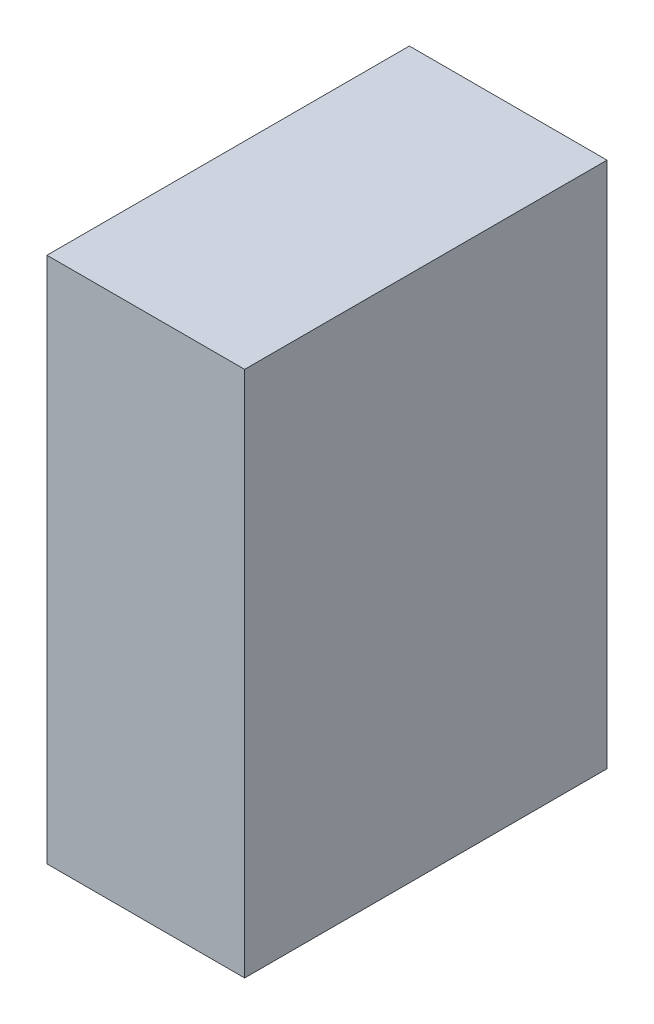
ISO-10303-21;
HEADER;
FILE_DESCRIPTION(('STEP AP214'),'2;1');
FILE_NAME('part.step','',(''),(''),'','','');
FILE_SCHEMA(('AUTOMOTIVE_DESIGN { 1 0 10303 214 1 1 1 1 }'));
ENDSEC;
DATA;
#1=APPLICATION_CONTEXT('core data for automotive mechanical design processes');
#2=APPLICATION_PROTOCOL_DEFINITION('international standard','automotive_design',2000,#1);
#3=PRODUCT_CONTEXT('',#1,'mechanical');
#4=PRODUCT('Part','Part','',(#3));
#5=PRODUCT_RELATED_PRODUCT_CATEGORY('part','',(#4));
#6=PRODUCT_DEFINITION_FORMATION('','',#4);
#7=PRODUCT_DEFINITION_CONTEXT('part definition',#1,'design');
#8=PRODUCT_DEFINITION('design','',#6,#7);
#9=PRODUCT_DEFINITION_SHAPE('','',#8);
#10=(LENGTH_UNIT() NAMED_UNIT(*) SI_UNIT(.MILLI.,.METRE.));
#11=(NAMED_UNIT(*) PLANE_ANGLE_UNIT() SI_UNIT($,.RADIAN.));
#12=(NAMED_UNIT(*) SI_UNIT($,.STERADIAN.) SOLID_ANGLE_UNIT());
#13=UNCERTAINTY_MEASURE_WITH_UNIT(LENGTH_MEASURE(1.E-05),#10,'distance_accuracy_value','');
#14=(GEOMETRIC_REPRESENTATION_CONTEXT(3) GLOBAL_UNCERTAINTY_ASSIGNED_CONTEXT((#13)) GLOBAL_UNIT_ASSIGNED_CONTEXT((#10,
#11,#12)) REPRESENTATION_CONTEXT('',''));
#15=CARTESIAN_POINT('',(0.,0.,0.));
#16=DIRECTION('',(0.,0.,1.));
#17=DIRECTION('',(1.,0.,0.));
#18=AXIS2_PLACEMENT_3D('',#15,#16,#17);
#19=CARTESIAN_POINT('',(0.3,0.,0.));
#20=DIRECTION('',(1.,0.,0.));
#21=DIRECTION('',(0.,0.,-1.));
#22=AXIS2_PLACEMENT_3D('',#19,#20,#21);
#23=PLANE('',#22);
#24=DIRECTION('',(0.,0.,1.));
#25=VECTOR('',#24,1.);
#26=CARTESIAN_POINT('',(0.3,0.8,0.));
#27=LINE('',#26,#25);
#28=CARTESIAN_POINT('',(0.3,0.8,0.55));
#29=VERTEX_POINT('',#28);
#30=CARTESIAN_POINT('',(0.3,0.8,0.));
#31=VERTEX_POINT('',#30);
#32=EDGE_CURVE('E76',#29,#31,#27,.F.);
#33=ORIENTED_EDGE('',*,*,#32,.F.);
#34=DIRECTION('',(0.,1.,0.));
#35=VECTOR('',#34,1.);
#36=CARTESIAN_POINT('',(0.3,0.,0.55));
#37=LINE('',#36,#35);
#38=CARTESIAN_POINT('',(0.3,0.,0.55));
#39=VERTEX_POINT('',#38);
#40=EDGE_CURVE('E58',#39,#29,#37,.T.);
#41=ORIENTED_EDGE('',*,*,#40,.F.);
#42=DIRECTION('',(0.,0.,1.));
#43=VECTOR('',#42,1.);
#44=CARTESIAN_POINT('',(0.3,0.,0.));
#45=LINE('',#44,#43);
#46=CARTESIAN_POINT('',(0.3,0.,0.));
#47=VERTEX_POINT('',#46);
#48=EDGE_CURVE('E20',#39,#47,#45,.F.);
#49=ORIENTED_EDGE('',*,*,#48,.T.);
#50=DIRECTION('',(0.,1.,0.));
#51=VECTOR('',#50,1.);
#52=CARTESIAN_POINT('',(0.3,0.,0.));
#53=LINE('',#52,#51);
#54=EDGE_CURVE('E55',#47,#31,#53,.T.);
#55=ORIENTED_EDGE('',*,*,#54,.T.);
#56=EDGE_LOOP('',(#33,#41,#49,#55));
#57=FACE_BOUND('',#56,.T.);
#58=ADVANCED_FACE('F17',(#57),#23,.T.);
#59=CARTESIAN_POINT('',(0.,0.,0.));
#60=DIRECTION('',(0.,1.,0.));
#61=DIRECTION('',(0.,0.,1.));
#62=AXIS2_PLACEMENT_3D('',#59,#60,#61);
#63=PLANE('',#62);
#64=DIRECTION('',(1.,0.,0.));
#65=VECTOR('',#64,1.);
#66=CARTESIAN_POINT('',(0.,0.,0.55));
#67=LINE('',#66,#65);
#68=CARTESIAN_POINT('',(0.,0.,0.55));
#69=VERTEX_POINT('',#68);
#70=EDGE_CURVE('E78',#69,#39,#67,.T.);
#71=ORIENTED_EDGE('',*,*,#70,.F.);
#72=DIRECTION('',(0.,0.,-1.));
#73=VECTOR('',#72,1.);
#74=CARTESIAN_POINT('',(0.,0.,0.));
#75=LINE('',#74,#73);
#76=CARTESIAN_POINT('',(0.,0.,0.));
#77=VERTEX_POINT('',#76);
#78=EDGE_CURVE('E73',#69,#77,#75,.T.);
#79=ORIENTED_EDGE('',*,*,#78,.T.);
#80=DIRECTION('',(1.,0.,0.));
#81=VECTOR('',#80,1.);
#82=CARTESIAN_POINT('',(0.,0.,0.));
#83=LINE('',#82,#81);
#84=EDGE_CURVE('E63',#77,#47,#83,.T.);
#85=ORIENTED_EDGE('',*,*,#84,.T.);
#86=ORIENTED_EDGE('',*,*,#48,.F.);
#87=EDGE_LOOP('',(#71,#79,#85,#86));
#88=FACE_BOUND('',#87,.T.);
#89=ADVANCED_FACE('F72',(#88),#63,.F.);
#90=CARTESIAN_POINT('',(0.,0.,0.));
#91=DIRECTION('',(0.,0.,1.));
#92=DIRECTION('',(1.,0.,0.));
#93=AXIS2_PLACEMENT_3D('',#90,#91,#92);
#94=PLANE('',#93);
#95=ORIENTED_EDGE('',*,*,#54,.F.);
#96=ORIENTED_EDGE('',*,*,#84,.F.);
#97=DIRECTION('',(0.,1.,0.));
#98=VECTOR('',#97,1.);
#99=CARTESIAN_POINT('',(0.,0.,0.));
#100=LINE('',#99,#98);
#101=CARTESIAN_POINT('',(0.,0.8,0.));
#102=VERTEX_POINT('',#101);
#103=EDGE_CURVE('E83',#77,#102,#100,.T.);
#104=ORIENTED_EDGE('',*,*,#103,.T.);
#105=DIRECTION('',(1.,0.,0.));
#106=VECTOR('',#105,1.);
#107=CARTESIAN_POINT('',(0.,0.8,0.));
#108=LINE('',#107,#106);
#109=EDGE_CURVE('E69',#31,#102,#108,.F.);
#110=ORIENTED_EDGE('',*,*,#109,.F.);
#111=EDGE_LOOP('',(#95,#96,#104,#110));
#112=FACE_BOUND('',#111,.T.);
#113=ADVANCED_FACE('F66',(#112),#94,.F.);
#114=CARTESIAN_POINT('',(0.,0.8,0.));
#115=DIRECTION('',(0.,1.,0.));
#116=DIRECTION('',(0.,0.,1.));
#117=AXIS2_PLACEMENT_3D('',#114,#115,#116);
#118=PLANE('',#117);
#119=DIRECTION('',(1.,0.,0.));
#120=VECTOR('',#119,1.);
#121=CARTESIAN_POINT('',(0.,0.8,0.55));
#122=LINE('',#121,#120);
#123=CARTESIAN_POINT('',(0.,0.8,0.55));
#124=VERTEX_POINT('',#123);
#125=EDGE_CURVE('E34',#29,#124,#122,.F.);
#126=ORIENTED_EDGE('',*,*,#125,.F.);
#127=ORIENTED_EDGE('',*,*,#32,.T.);
#128=ORIENTED_EDGE('',*,*,#109,.T.);
#129=DIRECTION('',(0.,0.,-1.));
#130=VECTOR('',#129,1.);
#131=CARTESIAN_POINT('',(0.,0.8,0.));
#132=LINE('',#131,#130);
#133=EDGE_CURVE('E26',#102,#124,#132,.F.);
#134=ORIENTED_EDGE('',*,*,#133,.T.);
#135=EDGE_LOOP('',(#126,#127,#128,#134));
#136=FACE_BOUND('',#135,.T.);
#137=ADVANCED_FACE('F88',(#136),#118,.T.);
#138=CARTESIAN_POINT('',(0.,0.,0.55));
#139=DIRECTION('',(0.,0.,1.));
#140=DIRECTION('',(1.,0.,0.));
#141=AXIS2_PLACEMENT_3D('',#138,#139,#140);
#142=PLANE('',#141);
#143=ORIENTED_EDGE('',*,*,#40,.T.);
#144=ORIENTED_EDGE('',*,*,#125,.T.);
#145=DIRECTION('',(0.,1.,0.));
#146=VECTOR('',#145,1.);
#147=CARTESIAN_POINT('',(0.,0.,0.55));
#148=LINE('',#147,#146);
#149=EDGE_CURVE('E11',#124,#69,#148,.F.);
#150=ORIENTED_EDGE('',*,*,#149,.T.);
#151=ORIENTED_EDGE('',*,*,#70,.T.);
#152=EDGE_LOOP('',(#143,#144,#150,#151));
#153=FACE_BOUND('',#152,.T.);
#154=ADVANCED_FACE('F91',(#153),#142,.T.);
#155=CARTESIAN_POINT('',(0.,0.,0.));
#156=DIRECTION('',(1.,0.,0.));
#157=DIRECTION('',(0.,0.,-1.));
#158=AXIS2_PLACEMENT_3D('',#155,#156,#157);
#159=PLANE('',#158);
#160=ORIENTED_EDGE('',*,*,#133,.F.);
#161=ORIENTED_EDGE('',*,*,#103,.F.);
#162=ORIENTED_EDGE('',*,*,#78,.F.);
#163=ORIENTED_EDGE('',*,*,#149,.F.);
#164=EDGE_LOOP('',(#160,#161,#162,#163));
#165=FACE_BOUND('',#164,.T.);
#166=ADVANCED_FACE('F90',(#165),#159,.F.);
#167=CLOSED_SHELL('',(#58,#89,#113,#137,#154,#166));
#168=MANIFOLD_SOLID_BREP('B1',#167);
#169=ADVANCED_BREP_SHAPE_REPRESENTATION('',(#18,#168),#14);
#170=SHAPE_DEFINITION_REPRESENTATION(#9,#169);
ENDSEC;
END-ISO-10303-21;
